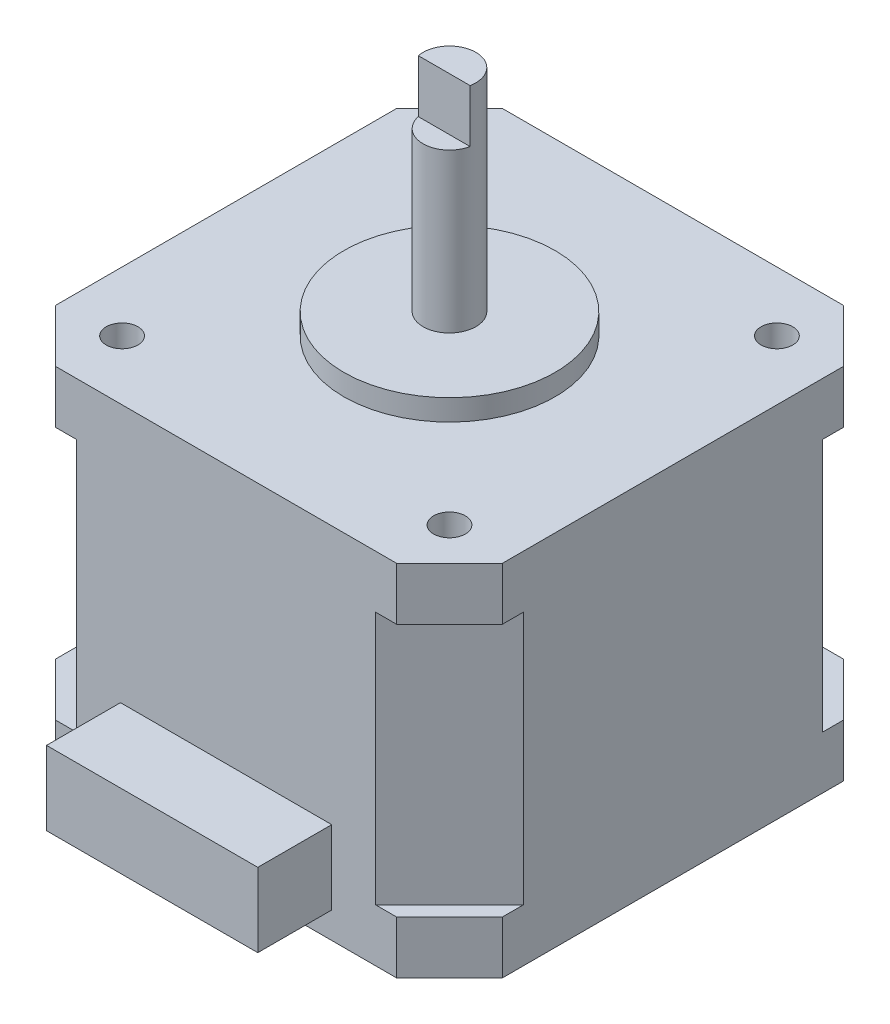
ISO-10303-21;
HEADER;
FILE_DESCRIPTION(('STEP AP214'),'2;1');
FILE_NAME('part.step','',(''),(''),'','','');
FILE_SCHEMA(('AUTOMOTIVE_DESIGN { 1 0 10303 214 1 1 1 1 }'));
ENDSEC;
DATA;
#1=APPLICATION_CONTEXT('core data for automotive mechanical design processes');
#2=APPLICATION_PROTOCOL_DEFINITION('international standard','automotive_design',2000,#1);
#3=PRODUCT_CONTEXT('',#1,'mechanical');
#4=PRODUCT('Part','Part','',(#3));
#5=PRODUCT_RELATED_PRODUCT_CATEGORY('part','',(#4));
#6=PRODUCT_DEFINITION_FORMATION('','',#4);
#7=PRODUCT_DEFINITION_CONTEXT('part definition',#1,'design');
#8=PRODUCT_DEFINITION('design','',#6,#7);
#9=PRODUCT_DEFINITION_SHAPE('','',#8);
#10=(LENGTH_UNIT() NAMED_UNIT(*) SI_UNIT(.MILLI.,.METRE.));
#11=(NAMED_UNIT(*) PLANE_ANGLE_UNIT() SI_UNIT($,.RADIAN.));
#12=(NAMED_UNIT(*) SI_UNIT($,.STERADIAN.) SOLID_ANGLE_UNIT());
#13=UNCERTAINTY_MEASURE_WITH_UNIT(LENGTH_MEASURE(1.E-05),#10,'distance_accuracy_value','');
#14=(GEOMETRIC_REPRESENTATION_CONTEXT(3) GLOBAL_UNCERTAINTY_ASSIGNED_CONTEXT((#13)) GLOBAL_UNIT_ASSIGNED_CONTEXT((#10,
#11,#12)) REPRESENTATION_CONTEXT('',''));
#15=CARTESIAN_POINT('',(0.,0.,0.));
#16=DIRECTION('',(0.,0.,1.));
#17=DIRECTION('',(1.,0.,0.));
#18=AXIS2_PLACEMENT_3D('',#15,#16,#17);
#19=CARTESIAN_POINT('',(-21.15,5.,21.15));
#20=DIRECTION('',(0.,0.,-1.));
#21=DIRECTION('',(-1.,0.,0.));
#22=AXIS2_PLACEMENT_3D('',#19,#20,#21);
#23=PLANE('',#22);
#24=DIRECTION('',(1.,0.,0.));
#25=VECTOR('',#24,1.);
#26=CARTESIAN_POINT('',(-21.15,29.,21.15));
#27=LINE('',#26,#25);
#28=CARTESIAN_POINT('',(14.15,29.,21.15));
#29=VERTEX_POINT('',#28);
#30=CARTESIAN_POINT('',(16.15,29.,21.15));
#31=VERTEX_POINT('',#30);
#32=EDGE_CURVE('E358',#29,#31,#27,.T.);
#33=ORIENTED_EDGE('',*,*,#32,.T.);
#34=DIRECTION('',(0.,1.,0.));
#35=VECTOR('',#34,1.);
#36=CARTESIAN_POINT('',(16.15,5.,21.15));
#37=LINE('',#36,#35);
#38=CARTESIAN_POINT('',(16.15,34.,21.15));
#39=VERTEX_POINT('',#38);
#40=EDGE_CURVE('E548',#31,#39,#37,.T.);
#41=ORIENTED_EDGE('',*,*,#40,.T.);
#42=DIRECTION('',(1.,0.,0.));
#43=VECTOR('',#42,1.);
#44=CARTESIAN_POINT('',(-21.15,34.,21.15));
#45=LINE('',#44,#43);
#46=CARTESIAN_POINT('',(-16.15,34.,21.15));
#47=VERTEX_POINT('',#46);
#48=EDGE_CURVE('E342',#47,#39,#45,.T.);
#49=ORIENTED_EDGE('',*,*,#48,.F.);
#50=DIRECTION('',(0.,-1.,0.));
#51=VECTOR('',#50,1.);
#52=CARTESIAN_POINT('',(-16.15,5.,21.15));
#53=LINE('',#52,#51);
#54=CARTESIAN_POINT('',(-16.15,29.,21.15));
#55=VERTEX_POINT('',#54);
#56=EDGE_CURVE('E544',#47,#55,#53,.T.);
#57=ORIENTED_EDGE('',*,*,#56,.T.);
#58=CARTESIAN_POINT('',(-14.15,29.,21.15));
#59=VERTEX_POINT('',#58);
#60=EDGE_CURVE('E334',#55,#59,#27,.T.);
#61=ORIENTED_EDGE('',*,*,#60,.T.);
#62=DIRECTION('',(0.,-1.,0.));
#63=VECTOR('',#62,1.);
#64=CARTESIAN_POINT('',(-14.15,29.,21.15));
#65=LINE('',#64,#63);
#66=CARTESIAN_POINT('',(-14.15,5.,21.15));
#67=VERTEX_POINT('',#66);
#68=EDGE_CURVE('E408',#59,#67,#65,.T.);
#69=ORIENTED_EDGE('',*,*,#68,.T.);
#70=DIRECTION('',(1.,0.,0.));
#71=VECTOR('',#70,1.);
#72=CARTESIAN_POINT('',(-21.15,5.,21.15));
#73=LINE('',#72,#71);
#74=CARTESIAN_POINT('',(-16.15,5.,21.15));
#75=VERTEX_POINT('',#74);
#76=EDGE_CURVE('E438',#75,#67,#73,.T.);
#77=ORIENTED_EDGE('',*,*,#76,.F.);
#78=DIRECTION('',(0.,-1.,0.));
#79=VECTOR('',#78,1.);
#80=CARTESIAN_POINT('',(-16.15,5.,21.15));
#81=LINE('',#80,#79);
#82=CARTESIAN_POINT('',(-16.15,0.,21.15));
#83=VERTEX_POINT('',#82);
#84=EDGE_CURVE('E508',#75,#83,#81,.T.);
#85=ORIENTED_EDGE('',*,*,#84,.T.);
#86=DIRECTION('',(1.,0.,0.));
#87=VECTOR('',#86,1.);
#88=CARTESIAN_POINT('',(-21.15,0.,21.15));
#89=LINE('',#88,#87);
#90=CARTESIAN_POINT('',(16.15,0.,21.15));
#91=VERTEX_POINT('',#90);
#92=EDGE_CURVE('E453',#83,#91,#89,.T.);
#93=ORIENTED_EDGE('',*,*,#92,.T.);
#94=DIRECTION('',(0.,1.,0.));
#95=VECTOR('',#94,1.);
#96=CARTESIAN_POINT('',(16.15,5.,21.15));
#97=LINE('',#96,#95);
#98=CARTESIAN_POINT('',(16.15,5.,21.15));
#99=VERTEX_POINT('',#98);
#100=EDGE_CURVE('E504',#91,#99,#97,.T.);
#101=ORIENTED_EDGE('',*,*,#100,.T.);
#102=CARTESIAN_POINT('',(14.15,5.,21.15));
#103=VERTEX_POINT('',#102);
#104=EDGE_CURVE('E437',#103,#99,#73,.T.);
#105=ORIENTED_EDGE('',*,*,#104,.F.);
#106=DIRECTION('',(0.,-1.,0.));
#107=VECTOR('',#106,1.);
#108=CARTESIAN_POINT('',(14.15,29.,21.15));
#109=LINE('',#108,#107);
#110=EDGE_CURVE('E404',#29,#103,#109,.T.);
#111=ORIENTED_EDGE('',*,*,#110,.F.);
#112=EDGE_LOOP('',(#33,#41,#49,#57,#61,#69,#77,#85,#93,#101,#105,#111));
#113=FACE_BOUND('',#112,.T.);
#114=DIRECTION('',(0.,1.,0.));
#115=VECTOR('',#114,1.);
#116=CARTESIAN_POINT('',(10.,2.5,21.15));
#117=LINE('',#116,#115);
#118=CARTESIAN_POINT('',(10.,2.5,21.15));
#119=VERTEX_POINT('',#118);
#120=CARTESIAN_POINT('',(10.,9.5,21.15));
#121=VERTEX_POINT('',#120);
#122=EDGE_CURVE('E278',#119,#121,#117,.T.);
#123=ORIENTED_EDGE('',*,*,#122,.F.);
#124=DIRECTION('',(1.,0.,0.));
#125=VECTOR('',#124,1.);
#126=CARTESIAN_POINT('',(-10.,2.5,21.15));
#127=LINE('',#126,#125);
#128=CARTESIAN_POINT('',(-10.,2.5,21.15));
#129=VERTEX_POINT('',#128);
#130=EDGE_CURVE('E285',#129,#119,#127,.T.);
#131=ORIENTED_EDGE('',*,*,#130,.F.);
#132=DIRECTION('',(0.,-1.,0.));
#133=VECTOR('',#132,1.);
#134=CARTESIAN_POINT('',(-10.,2.5,21.15));
#135=LINE('',#134,#133);
#136=CARTESIAN_POINT('',(-10.,9.5,21.15));
#137=VERTEX_POINT('',#136);
#138=EDGE_CURVE('E300',#137,#129,#135,.T.);
#139=ORIENTED_EDGE('',*,*,#138,.F.);
#140=DIRECTION('',(-1.,0.,0.));
#141=VECTOR('',#140,1.);
#142=CARTESIAN_POINT('',(-10.,9.5,21.15));
#143=LINE('',#142,#141);
#144=EDGE_CURVE('E79',#121,#137,#143,.T.);
#145=ORIENTED_EDGE('',*,*,#144,.F.);
#146=EDGE_LOOP('',(#123,#131,#139,#145));
#147=FACE_BOUND('',#146,.T.);
#148=ADVANCED_FACE('F52',(#113,#147),#23,.F.);
#149=CARTESIAN_POINT('',(0.,5.,0.));
#150=DIRECTION('',(0.,-1.,0.));
#151=DIRECTION('',(0.,0.,-1.));
#152=AXIS2_PLACEMENT_3D('',#149,#150,#151);
#153=PLANE('',#152);
#154=DIRECTION('',(-0.707106781186548,0.,-0.707106781186547));
#155=VECTOR('',#154,1.);
#156=CARTESIAN_POINT('',(14.15,5.,-21.15));
#157=LINE('',#156,#155);
#158=CARTESIAN_POINT('',(21.15,5.,-14.15));
#159=VERTEX_POINT('',#158);
#160=CARTESIAN_POINT('',(14.15,5.,-21.15));
#161=VERTEX_POINT('',#160);
#162=EDGE_CURVE('E366',#159,#161,#157,.T.);
#163=ORIENTED_EDGE('',*,*,#162,.F.);
#164=DIRECTION('',(0.,0.,-1.));
#165=VECTOR('',#164,1.);
#166=CARTESIAN_POINT('',(21.15,5.,21.15));
#167=LINE('',#166,#165);
#168=CARTESIAN_POINT('',(21.15,5.,-16.15));
#169=VERTEX_POINT('',#168);
#170=EDGE_CURVE('E429',#159,#169,#167,.T.);
#171=ORIENTED_EDGE('',*,*,#170,.T.);
#172=DIRECTION('',(0.707106781186546,0.,0.707106781186549));
#173=VECTOR('',#172,1.);
#174=CARTESIAN_POINT('',(16.15,5.,-21.15));
#175=LINE('',#174,#173);
#176=CARTESIAN_POINT('',(16.15,5.,-21.15));
#177=VERTEX_POINT('',#176);
#178=EDGE_CURVE('E493',#169,#177,#175,.F.);
#179=ORIENTED_EDGE('',*,*,#178,.T.);
#180=DIRECTION('',(-1.,0.,0.));
#181=VECTOR('',#180,1.);
#182=CARTESIAN_POINT('',(-21.15,5.,-21.15));
#183=LINE('',#182,#181);
#184=EDGE_CURVE('E430',#177,#161,#183,.T.);
#185=ORIENTED_EDGE('',*,*,#184,.T.);
#186=EDGE_LOOP('',(#163,#171,#179,#185));
#187=FACE_BOUND('',#186,.T.);
#188=ADVANCED_FACE('F657',(#187),#153,.F.);
#189=DIRECTION('',(0.707106781186547,0.,-0.707106781186548));
#190=VECTOR('',#189,1.);
#191=CARTESIAN_POINT('',(14.15,5.,21.15));
#192=LINE('',#191,#190);
#193=CARTESIAN_POINT('',(21.15,5.,14.15));
#194=VERTEX_POINT('',#193);
#195=EDGE_CURVE('E386',#103,#194,#192,.T.);
#196=ORIENTED_EDGE('',*,*,#195,.F.);
#197=ORIENTED_EDGE('',*,*,#104,.T.);
#198=DIRECTION('',(-0.707106781186549,0.,0.707106781186546));
#199=VECTOR('',#198,1.);
#200=CARTESIAN_POINT('',(21.15,5.,16.15));
#201=LINE('',#200,#199);
#202=CARTESIAN_POINT('',(21.15,5.,16.15));
#203=VERTEX_POINT('',#202);
#204=EDGE_CURVE('E484',#99,#203,#201,.F.);
#205=ORIENTED_EDGE('',*,*,#204,.T.);
#206=EDGE_CURVE('E425',#203,#194,#167,.T.);
#207=ORIENTED_EDGE('',*,*,#206,.T.);
#208=EDGE_LOOP('',(#196,#197,#205,#207));
#209=FACE_BOUND('',#208,.T.);
#210=ADVANCED_FACE('F664',(#209),#153,.F.);
#211=DIRECTION('',(0.707106781186547,0.,0.707106781186548));
#212=VECTOR('',#211,1.);
#213=CARTESIAN_POINT('',(-21.15,5.,14.15));
#214=LINE('',#213,#212);
#215=CARTESIAN_POINT('',(-21.15,5.,14.15));
#216=VERTEX_POINT('',#215);
#217=EDGE_CURVE('E382',#216,#67,#214,.T.);
#218=ORIENTED_EDGE('',*,*,#217,.F.);
#219=DIRECTION('',(0.,0.,1.));
#220=VECTOR('',#219,1.);
#221=CARTESIAN_POINT('',(-21.15,5.,21.15));
#222=LINE('',#221,#220);
#223=CARTESIAN_POINT('',(-21.15,5.,16.15));
#224=VERTEX_POINT('',#223);
#225=EDGE_CURVE('E433',#216,#224,#222,.T.);
#226=ORIENTED_EDGE('',*,*,#225,.T.);
#227=DIRECTION('',(-0.707106781186546,0.,-0.707106781186549));
#228=VECTOR('',#227,1.);
#229=CARTESIAN_POINT('',(-16.15,5.,21.15));
#230=LINE('',#229,#228);
#231=EDGE_CURVE('E487',#224,#75,#230,.F.);
#232=ORIENTED_EDGE('',*,*,#231,.T.);
#233=ORIENTED_EDGE('',*,*,#76,.T.);
#234=EDGE_LOOP('',(#218,#226,#232,#233));
#235=FACE_BOUND('',#234,.T.);
#236=ADVANCED_FACE('F725',(#235),#153,.F.);
#237=DIRECTION('',(-0.707106781186547,0.,0.707106781186548));
#238=VECTOR('',#237,1.);
#239=CARTESIAN_POINT('',(-21.15,5.,-14.15));
#240=LINE('',#239,#238);
#241=CARTESIAN_POINT('',(-14.15,5.,-21.15));
#242=VERTEX_POINT('',#241);
#243=CARTESIAN_POINT('',(-21.15,5.,-14.15));
#244=VERTEX_POINT('',#243);
#245=EDGE_CURVE('E346',#242,#244,#240,.T.);
#246=ORIENTED_EDGE('',*,*,#245,.F.);
#247=CARTESIAN_POINT('',(-16.15,5.,-21.15));
#248=VERTEX_POINT('',#247);
#249=EDGE_CURVE('E428',#242,#248,#183,.T.);
#250=ORIENTED_EDGE('',*,*,#249,.T.);
#251=DIRECTION('',(0.707106781186549,0.,-0.707106781186546));
#252=VECTOR('',#251,1.);
#253=CARTESIAN_POINT('',(-21.15,5.,-16.15));
#254=LINE('',#253,#252);
#255=CARTESIAN_POINT('',(-21.15,5.,-16.15));
#256=VERTEX_POINT('',#255);
#257=EDGE_CURVE('E490',#248,#256,#254,.F.);
#258=ORIENTED_EDGE('',*,*,#257,.T.);
#259=EDGE_CURVE('E434',#256,#244,#222,.T.);
#260=ORIENTED_EDGE('',*,*,#259,.T.);
#261=EDGE_LOOP('',(#246,#250,#258,#260));
#262=FACE_BOUND('',#261,.T.);
#263=ADVANCED_FACE('F588',(#262),#153,.F.);
#264=CARTESIAN_POINT('',(21.15,5.,21.15));
#265=DIRECTION('',(-1.,0.,0.));
#266=DIRECTION('',(0.,0.,1.));
#267=AXIS2_PLACEMENT_3D('',#264,#265,#266);
#268=PLANE('',#267);
#269=DIRECTION('',(0.,0.,-1.));
#270=VECTOR('',#269,1.);
#271=CARTESIAN_POINT('',(21.15,29.,-21.15));
#272=LINE('',#271,#270);
#273=CARTESIAN_POINT('',(21.15,29.,-14.15));
#274=VERTEX_POINT('',#273);
#275=CARTESIAN_POINT('',(21.15,29.,-16.15));
#276=VERTEX_POINT('',#275);
#277=EDGE_CURVE('E325',#274,#276,#272,.T.);
#278=ORIENTED_EDGE('',*,*,#277,.T.);
#279=DIRECTION('',(0.,1.,0.));
#280=VECTOR('',#279,1.);
#281=CARTESIAN_POINT('',(21.15,5.,-16.15));
#282=LINE('',#281,#280);
#283=CARTESIAN_POINT('',(21.15,34.,-16.15));
#284=VERTEX_POINT('',#283);
#285=EDGE_CURVE('E526',#276,#284,#282,.T.);
#286=ORIENTED_EDGE('',*,*,#285,.T.);
#287=DIRECTION('',(0.,0.,-1.));
#288=VECTOR('',#287,1.);
#289=CARTESIAN_POINT('',(21.15,34.,-21.15));
#290=LINE('',#289,#288);
#291=CARTESIAN_POINT('',(21.15,34.,16.15));
#292=VERTEX_POINT('',#291);
#293=EDGE_CURVE('E329',#292,#284,#290,.T.);
#294=ORIENTED_EDGE('',*,*,#293,.F.);
#295=DIRECTION('',(0.,-1.,0.));
#296=VECTOR('',#295,1.);
#297=CARTESIAN_POINT('',(21.15,5.,16.15));
#298=LINE('',#297,#296);
#299=CARTESIAN_POINT('',(21.15,29.,16.15));
#300=VERTEX_POINT('',#299);
#301=EDGE_CURVE('E522',#292,#300,#298,.T.);
#302=ORIENTED_EDGE('',*,*,#301,.T.);
#303=CARTESIAN_POINT('',(21.15,29.,14.15));
#304=VERTEX_POINT('',#303);
#305=EDGE_CURVE('E347',#300,#304,#272,.T.);
#306=ORIENTED_EDGE('',*,*,#305,.T.);
#307=DIRECTION('',(0.,-1.,0.));
#308=VECTOR('',#307,1.);
#309=CARTESIAN_POINT('',(21.15,29.,14.15));
#310=LINE('',#309,#308);
#311=EDGE_CURVE('E400',#304,#194,#310,.T.);
#312=ORIENTED_EDGE('',*,*,#311,.T.);
#313=ORIENTED_EDGE('',*,*,#206,.F.);
#314=DIRECTION('',(0.,-1.,0.));
#315=VECTOR('',#314,1.);
#316=CARTESIAN_POINT('',(21.15,5.,16.15));
#317=LINE('',#316,#315);
#318=CARTESIAN_POINT('',(21.15,0.,16.15));
#319=VERTEX_POINT('',#318);
#320=EDGE_CURVE('E476',#203,#319,#317,.T.);
#321=ORIENTED_EDGE('',*,*,#320,.T.);
#322=DIRECTION('',(0.,0.,-1.));
#323=VECTOR('',#322,1.);
#324=CARTESIAN_POINT('',(21.15,0.,21.15));
#325=LINE('',#324,#323);
#326=CARTESIAN_POINT('',(21.15,0.,-16.15));
#327=VERTEX_POINT('',#326);
#328=EDGE_CURVE('E424',#319,#327,#325,.T.);
#329=ORIENTED_EDGE('',*,*,#328,.T.);
#330=DIRECTION('',(0.,1.,0.));
#331=VECTOR('',#330,1.);
#332=CARTESIAN_POINT('',(21.15,5.,-16.15));
#333=LINE('',#332,#331);
#334=EDGE_CURVE('E480',#327,#169,#333,.T.);
#335=ORIENTED_EDGE('',*,*,#334,.T.);
#336=ORIENTED_EDGE('',*,*,#170,.F.);
#337=DIRECTION('',(0.,-1.,0.));
#338=VECTOR('',#337,1.);
#339=CARTESIAN_POINT('',(21.15,29.,-14.15));
#340=LINE('',#339,#338);
#341=EDGE_CURVE('E396',#274,#159,#340,.T.);
#342=ORIENTED_EDGE('',*,*,#341,.F.);
#343=EDGE_LOOP('',(#278,#286,#294,#302,#306,#312,#313,#321,#329,#335,#336,#342));
#344=FACE_BOUND('',#343,.T.);
#345=ADVANCED_FACE('F602',(#344),#268,.F.);
#346=CARTESIAN_POINT('',(-21.15,5.,-21.15));
#347=DIRECTION('',(0.,0.,1.));
#348=DIRECTION('',(1.,0.,0.));
#349=AXIS2_PLACEMENT_3D('',#346,#347,#348);
#350=PLANE('',#349);
#351=DIRECTION('',(-1.,0.,0.));
#352=VECTOR('',#351,1.);
#353=CARTESIAN_POINT('',(-21.15,34.,-21.15));
#354=LINE('',#353,#352);
#355=CARTESIAN_POINT('',(16.15,34.,-21.15));
#356=VERTEX_POINT('',#355);
#357=CARTESIAN_POINT('',(-16.15,34.,-21.15));
#358=VERTEX_POINT('',#357);
#359=EDGE_CURVE('E333',#356,#358,#354,.T.);
#360=ORIENTED_EDGE('',*,*,#359,.F.);
#361=DIRECTION('',(0.,-1.,0.));
#362=VECTOR('',#361,1.);
#363=CARTESIAN_POINT('',(16.15,5.,-21.15));
#364=LINE('',#363,#362);
#365=CARTESIAN_POINT('',(16.15,29.,-21.15));
#366=VERTEX_POINT('',#365);
#367=EDGE_CURVE('E515',#356,#366,#364,.T.);
#368=ORIENTED_EDGE('',*,*,#367,.T.);
#369=DIRECTION('',(-1.,0.,0.));
#370=VECTOR('',#369,1.);
#371=CARTESIAN_POINT('',(-21.15,29.,-21.15));
#372=LINE('',#371,#370);
#373=CARTESIAN_POINT('',(14.15,29.,-21.15));
#374=VERTEX_POINT('',#373);
#375=EDGE_CURVE('E351',#366,#374,#372,.T.);
#376=ORIENTED_EDGE('',*,*,#375,.T.);
#377=DIRECTION('',(0.,-1.,0.));
#378=VECTOR('',#377,1.);
#379=CARTESIAN_POINT('',(14.15,29.,-21.15));
#380=LINE('',#379,#378);
#381=EDGE_CURVE('E378',#374,#161,#380,.T.);
#382=ORIENTED_EDGE('',*,*,#381,.T.);
#383=ORIENTED_EDGE('',*,*,#184,.F.);
#384=DIRECTION('',(0.,-1.,0.));
#385=VECTOR('',#384,1.);
#386=CARTESIAN_POINT('',(16.15,5.,-21.15));
#387=LINE('',#386,#385);
#388=CARTESIAN_POINT('',(16.15,0.,-21.15));
#389=VERTEX_POINT('',#388);
#390=EDGE_CURVE('E460',#177,#389,#387,.T.);
#391=ORIENTED_EDGE('',*,*,#390,.T.);
#392=DIRECTION('',(-1.,0.,0.));
#393=VECTOR('',#392,1.);
#394=CARTESIAN_POINT('',(-21.15,0.,-21.15));
#395=LINE('',#394,#393);
#396=CARTESIAN_POINT('',(-16.15,0.,-21.15));
#397=VERTEX_POINT('',#396);
#398=EDGE_CURVE('E445',#389,#397,#395,.T.);
#399=ORIENTED_EDGE('',*,*,#398,.T.);
#400=DIRECTION('',(0.,1.,0.));
#401=VECTOR('',#400,1.);
#402=CARTESIAN_POINT('',(-16.15,5.,-21.15));
#403=LINE('',#402,#401);
#404=EDGE_CURVE('E441',#397,#248,#403,.T.);
#405=ORIENTED_EDGE('',*,*,#404,.T.);
#406=ORIENTED_EDGE('',*,*,#249,.F.);
#407=DIRECTION('',(0.,-1.,0.));
#408=VECTOR('',#407,1.);
#409=CARTESIAN_POINT('',(-14.15,29.,-21.15));
#410=LINE('',#409,#408);
#411=CARTESIAN_POINT('',(-14.15,29.,-21.15));
#412=VERTEX_POINT('',#411);
#413=EDGE_CURVE('E420',#412,#242,#410,.T.);
#414=ORIENTED_EDGE('',*,*,#413,.F.);
#415=CARTESIAN_POINT('',(-16.15,29.,-21.15));
#416=VERTEX_POINT('',#415);
#417=EDGE_CURVE('E350',#412,#416,#372,.T.);
#418=ORIENTED_EDGE('',*,*,#417,.T.);
#419=DIRECTION('',(0.,1.,0.));
#420=VECTOR('',#419,1.);
#421=CARTESIAN_POINT('',(-16.15,5.,-21.15));
#422=LINE('',#421,#420);
#423=EDGE_CURVE('E512',#416,#358,#422,.T.);
#424=ORIENTED_EDGE('',*,*,#423,.T.);
#425=EDGE_LOOP('',(#360,#368,#376,#382,#383,#391,#399,#405,#406,#414,#418,#424));
#426=FACE_BOUND('',#425,.T.);
#427=ADVANCED_FACE('F575',(#426),#350,.F.);
#428=CARTESIAN_POINT('',(-21.15,5.,21.15));
#429=DIRECTION('',(1.,0.,0.));
#430=DIRECTION('',(0.,0.,-1.));
#431=AXIS2_PLACEMENT_3D('',#428,#429,#430);
#432=PLANE('',#431);
#433=DIRECTION('',(0.,0.,1.));
#434=VECTOR('',#433,1.);
#435=CARTESIAN_POINT('',(-21.15,29.,-21.15));
#436=LINE('',#435,#434);
#437=CARTESIAN_POINT('',(-21.15,29.,14.15));
#438=VERTEX_POINT('',#437);
#439=CARTESIAN_POINT('',(-21.15,29.,16.15));
#440=VERTEX_POINT('',#439);
#441=EDGE_CURVE('E354',#438,#440,#436,.T.);
#442=ORIENTED_EDGE('',*,*,#441,.T.);
#443=DIRECTION('',(0.,1.,0.));
#444=VECTOR('',#443,1.);
#445=CARTESIAN_POINT('',(-21.15,5.,16.15));
#446=LINE('',#445,#444);
#447=CARTESIAN_POINT('',(-21.15,34.,16.15));
#448=VERTEX_POINT('',#447);
#449=EDGE_CURVE('E557',#440,#448,#446,.T.);
#450=ORIENTED_EDGE('',*,*,#449,.T.);
#451=DIRECTION('',(0.,0.,1.));
#452=VECTOR('',#451,1.);
#453=CARTESIAN_POINT('',(-21.15,34.,-21.15));
#454=LINE('',#453,#452);
#455=CARTESIAN_POINT('',(-21.15,34.,-16.15));
#456=VERTEX_POINT('',#455);
#457=EDGE_CURVE('E338',#456,#448,#454,.T.);
#458=ORIENTED_EDGE('',*,*,#457,.F.);
#459=DIRECTION('',(0.,-1.,0.));
#460=VECTOR('',#459,1.);
#461=CARTESIAN_POINT('',(-21.15,5.,-16.15));
#462=LINE('',#461,#460);
#463=CARTESIAN_POINT('',(-21.15,29.,-16.15));
#464=VERTEX_POINT('',#463);
#465=EDGE_CURVE('E554',#456,#464,#462,.T.);
#466=ORIENTED_EDGE('',*,*,#465,.T.);
#467=CARTESIAN_POINT('',(-21.15,29.,-14.15));
#468=VERTEX_POINT('',#467);
#469=EDGE_CURVE('E355',#464,#468,#436,.T.);
#470=ORIENTED_EDGE('',*,*,#469,.T.);
#471=DIRECTION('',(0.,-1.,0.));
#472=VECTOR('',#471,1.);
#473=CARTESIAN_POINT('',(-21.15,29.,-14.15));
#474=LINE('',#473,#472);
#475=EDGE_CURVE('E416',#468,#244,#474,.T.);
#476=ORIENTED_EDGE('',*,*,#475,.T.);
#477=ORIENTED_EDGE('',*,*,#259,.F.);
#478=DIRECTION('',(0.,-1.,0.));
#479=VECTOR('',#478,1.);
#480=CARTESIAN_POINT('',(-21.15,5.,-16.15));
#481=LINE('',#480,#479);
#482=CARTESIAN_POINT('',(-21.15,0.,-16.15));
#483=VERTEX_POINT('',#482);
#484=EDGE_CURVE('E500',#256,#483,#481,.T.);
#485=ORIENTED_EDGE('',*,*,#484,.T.);
#486=DIRECTION('',(0.,0.,1.));
#487=VECTOR('',#486,1.);
#488=CARTESIAN_POINT('',(-21.15,0.,21.15));
#489=LINE('',#488,#487);
#490=CARTESIAN_POINT('',(-21.15,0.,16.15));
#491=VERTEX_POINT('',#490);
#492=EDGE_CURVE('E449',#483,#491,#489,.T.);
#493=ORIENTED_EDGE('',*,*,#492,.T.);
#494=DIRECTION('',(0.,1.,0.));
#495=VECTOR('',#494,1.);
#496=CARTESIAN_POINT('',(-21.15,5.,16.15));
#497=LINE('',#496,#495);
#498=EDGE_CURVE('E496',#491,#224,#497,.T.);
#499=ORIENTED_EDGE('',*,*,#498,.T.);
#500=ORIENTED_EDGE('',*,*,#225,.F.);
#501=DIRECTION('',(0.,-1.,0.));
#502=VECTOR('',#501,1.);
#503=CARTESIAN_POINT('',(-21.15,29.,14.15));
#504=LINE('',#503,#502);
#505=EDGE_CURVE('E412',#438,#216,#504,.T.);
#506=ORIENTED_EDGE('',*,*,#505,.F.);
#507=EDGE_LOOP('',(#442,#450,#458,#466,#470,#476,#477,#485,#493,#499,#500,#506));
#508=FACE_BOUND('',#507,.T.);
#509=ADVANCED_FACE('F582',(#508),#432,.F.);
#510=CARTESIAN_POINT('',(0.,0.,0.));
#511=DIRECTION('',(0.,-1.,0.));
#512=DIRECTION('',(0.,0.,-1.));
#513=AXIS2_PLACEMENT_3D('',#510,#511,#512);
#514=PLANE('',#513);
#515=ORIENTED_EDGE('',*,*,#398,.F.);
#516=DIRECTION('',(-0.707106781186546,0.,-0.707106781186549));
#517=VECTOR('',#516,1.);
#518=CARTESIAN_POINT('',(18.65,0.,-18.65));
#519=LINE('',#518,#517);
#520=EDGE_CURVE('E473',#389,#327,#519,.F.);
#521=ORIENTED_EDGE('',*,*,#520,.T.);
#522=ORIENTED_EDGE('',*,*,#328,.F.);
#523=DIRECTION('',(0.707106781186549,0.,-0.707106781186546));
#524=VECTOR('',#523,1.);
#525=CARTESIAN_POINT('',(18.65,0.,18.65));
#526=LINE('',#525,#524);
#527=EDGE_CURVE('E464',#319,#91,#526,.F.);
#528=ORIENTED_EDGE('',*,*,#527,.T.);
#529=ORIENTED_EDGE('',*,*,#92,.F.);
#530=DIRECTION('',(0.707106781186546,0.,0.707106781186549));
#531=VECTOR('',#530,1.);
#532=CARTESIAN_POINT('',(-18.65,0.,18.65));
#533=LINE('',#532,#531);
#534=EDGE_CURVE('E467',#83,#491,#533,.F.);
#535=ORIENTED_EDGE('',*,*,#534,.T.);
#536=ORIENTED_EDGE('',*,*,#492,.F.);
#537=DIRECTION('',(-0.707106781186549,0.,0.707106781186546));
#538=VECTOR('',#537,1.);
#539=CARTESIAN_POINT('',(-18.65,0.,-18.65));
#540=LINE('',#539,#538);
#541=EDGE_CURVE('E470',#483,#397,#540,.F.);
#542=ORIENTED_EDGE('',*,*,#541,.T.);
#543=EDGE_LOOP('',(#515,#521,#522,#528,#529,#535,#536,#542));
#544=FACE_BOUND('',#543,.T.);
#545=ADVANCED_FACE('F626',(#544),#514,.T.);
#546=CARTESIAN_POINT('',(16.15,5.,-21.15));
#547=DIRECTION('',(-0.707106781186549,0.,0.707106781186546));
#548=DIRECTION('',(0.,-1.,0.));
#549=AXIS2_PLACEMENT_3D('',#546,#547,#548);
#550=PLANE('',#549);
#551=ORIENTED_EDGE('',*,*,#178,.F.);
#552=ORIENTED_EDGE('',*,*,#334,.F.);
#553=ORIENTED_EDGE('',*,*,#520,.F.);
#554=ORIENTED_EDGE('',*,*,#390,.F.);
#555=EDGE_LOOP('',(#551,#552,#553,#554));
#556=FACE_BOUND('',#555,.T.);
#557=ADVANCED_FACE('F622',(#556),#550,.F.);
#558=CARTESIAN_POINT('',(-21.15,5.,-16.15));
#559=DIRECTION('',(0.707106781186546,0.,0.707106781186549));
#560=DIRECTION('',(0.,-1.,0.));
#561=AXIS2_PLACEMENT_3D('',#558,#559,#560);
#562=PLANE('',#561);
#563=ORIENTED_EDGE('',*,*,#257,.F.);
#564=ORIENTED_EDGE('',*,*,#404,.F.);
#565=ORIENTED_EDGE('',*,*,#541,.F.);
#566=ORIENTED_EDGE('',*,*,#484,.F.);
#567=EDGE_LOOP('',(#563,#564,#565,#566));
#568=FACE_BOUND('',#567,.T.);
#569=ADVANCED_FACE('F646',(#568),#562,.F.);
#570=CARTESIAN_POINT('',(-16.15,5.,21.15));
#571=DIRECTION('',(0.707106781186549,0.,-0.707106781186546));
#572=DIRECTION('',(0.,-1.,0.));
#573=AXIS2_PLACEMENT_3D('',#570,#571,#572);
#574=PLANE('',#573);
#575=ORIENTED_EDGE('',*,*,#231,.F.);
#576=ORIENTED_EDGE('',*,*,#498,.F.);
#577=ORIENTED_EDGE('',*,*,#534,.F.);
#578=ORIENTED_EDGE('',*,*,#84,.F.);
#579=EDGE_LOOP('',(#575,#576,#577,#578));
#580=FACE_BOUND('',#579,.T.);
#581=ADVANCED_FACE('F640',(#580),#574,.F.);
#582=CARTESIAN_POINT('',(21.15,5.,16.15));
#583=DIRECTION('',(-0.707106781186546,0.,-0.707106781186549));
#584=DIRECTION('',(0.,-1.,0.));
#585=AXIS2_PLACEMENT_3D('',#582,#583,#584);
#586=PLANE('',#585);
#587=ORIENTED_EDGE('',*,*,#204,.F.);
#588=ORIENTED_EDGE('',*,*,#100,.F.);
#589=ORIENTED_EDGE('',*,*,#527,.F.);
#590=ORIENTED_EDGE('',*,*,#320,.F.);
#591=EDGE_LOOP('',(#587,#588,#589,#590));
#592=FACE_BOUND('',#591,.T.);
#593=ADVANCED_FACE('F631',(#592),#586,.F.);
#594=CARTESIAN_POINT('',(-21.15,29.,-14.15));
#595=DIRECTION('',(0.707106781186548,0.,0.707106781186547));
#596=DIRECTION('',(0.707106781186547,0.,-0.707106781186548));
#597=AXIS2_PLACEMENT_3D('',#594,#595,#596);
#598=PLANE('',#597);
#599=ORIENTED_EDGE('',*,*,#245,.T.);
#600=ORIENTED_EDGE('',*,*,#475,.F.);
#601=DIRECTION('',(-0.707106781186547,0.,0.707106781186548));
#602=VECTOR('',#601,1.);
#603=CARTESIAN_POINT('',(-21.15,29.,-14.15));
#604=LINE('',#603,#602);
#605=EDGE_CURVE('E361',#412,#468,#604,.T.);
#606=ORIENTED_EDGE('',*,*,#605,.F.);
#607=ORIENTED_EDGE('',*,*,#413,.T.);
#608=EDGE_LOOP('',(#599,#600,#606,#607));
#609=FACE_BOUND('',#608,.T.);
#610=ADVANCED_FACE('F586',(#609),#598,.F.);
#611=CARTESIAN_POINT('',(-21.15,29.,14.15));
#612=DIRECTION('',(0.707106781186548,0.,-0.707106781186547));
#613=DIRECTION('',(-0.707106781186547,0.,-0.707106781186548));
#614=AXIS2_PLACEMENT_3D('',#611,#612,#613);
#615=PLANE('',#614);
#616=ORIENTED_EDGE('',*,*,#217,.T.);
#617=ORIENTED_EDGE('',*,*,#68,.F.);
#618=DIRECTION('',(0.707106781186547,0.,0.707106781186548));
#619=VECTOR('',#618,1.);
#620=CARTESIAN_POINT('',(-21.15,29.,14.15));
#621=LINE('',#620,#619);
#622=EDGE_CURVE('E365',#438,#59,#621,.T.);
#623=ORIENTED_EDGE('',*,*,#622,.F.);
#624=ORIENTED_EDGE('',*,*,#505,.T.);
#625=EDGE_LOOP('',(#616,#617,#623,#624));
#626=FACE_BOUND('',#625,.T.);
#627=ADVANCED_FACE('F728',(#626),#615,.F.);
#628=CARTESIAN_POINT('',(14.15,29.,21.15));
#629=DIRECTION('',(-0.707106781186548,0.,-0.707106781186547));
#630=DIRECTION('',(-0.707106781186547,0.,0.707106781186548));
#631=AXIS2_PLACEMENT_3D('',#628,#629,#630);
#632=PLANE('',#631);
#633=ORIENTED_EDGE('',*,*,#195,.T.);
#634=ORIENTED_EDGE('',*,*,#311,.F.);
#635=DIRECTION('',(0.707106781186547,0.,-0.707106781186548));
#636=VECTOR('',#635,1.);
#637=CARTESIAN_POINT('',(14.15,29.,21.15));
#638=LINE('',#637,#636);
#639=EDGE_CURVE('E370',#29,#304,#638,.T.);
#640=ORIENTED_EDGE('',*,*,#639,.F.);
#641=ORIENTED_EDGE('',*,*,#110,.T.);
#642=EDGE_LOOP('',(#633,#634,#640,#641));
#643=FACE_BOUND('',#642,.T.);
#644=ADVANCED_FACE('F721',(#643),#632,.F.);
#645=CARTESIAN_POINT('',(14.15,29.,-21.15));
#646=DIRECTION('',(-0.707106781186547,0.,0.707106781186548));
#647=DIRECTION('',(0.707106781186548,0.,0.707106781186547));
#648=AXIS2_PLACEMENT_3D('',#645,#646,#647);
#649=PLANE('',#648);
#650=ORIENTED_EDGE('',*,*,#162,.T.);
#651=ORIENTED_EDGE('',*,*,#381,.F.);
#652=DIRECTION('',(-0.707106781186548,0.,-0.707106781186547));
#653=VECTOR('',#652,1.);
#654=CARTESIAN_POINT('',(14.15,29.,-21.15));
#655=LINE('',#654,#653);
#656=EDGE_CURVE('E374',#274,#374,#655,.T.);
#657=ORIENTED_EDGE('',*,*,#656,.F.);
#658=ORIENTED_EDGE('',*,*,#341,.T.);
#659=EDGE_LOOP('',(#650,#651,#657,#658));
#660=FACE_BOUND('',#659,.T.);
#661=ADVANCED_FACE('F615',(#660),#649,.F.);
#662=CARTESIAN_POINT('',(0.,29.,0.));
#663=DIRECTION('',(0.,1.,0.));
#664=DIRECTION('',(0.,0.,1.));
#665=AXIS2_PLACEMENT_3D('',#662,#663,#664);
#666=PLANE('',#665);
#667=ORIENTED_EDGE('',*,*,#469,.F.);
#668=DIRECTION('',(-0.707106781186549,0.,0.707106781186547));
#669=VECTOR('',#668,1.);
#670=CARTESIAN_POINT('',(-21.15,29.,-16.15));
#671=LINE('',#670,#669);
#672=EDGE_CURVE('E57',#464,#416,#671,.F.);
#673=ORIENTED_EDGE('',*,*,#672,.T.);
#674=ORIENTED_EDGE('',*,*,#417,.F.);
#675=ORIENTED_EDGE('',*,*,#605,.T.);
#676=EDGE_LOOP('',(#667,#673,#674,#675));
#677=FACE_BOUND('',#676,.T.);
#678=ADVANCED_FACE('F568',(#677),#666,.F.);
#679=ORIENTED_EDGE('',*,*,#60,.F.);
#680=DIRECTION('',(0.707106781186546,0.,0.707106781186549));
#681=VECTOR('',#680,1.);
#682=CARTESIAN_POINT('',(-16.15,29.,21.15));
#683=LINE('',#682,#681);
#684=EDGE_CURVE('E551',#55,#440,#683,.F.);
#685=ORIENTED_EDGE('',*,*,#684,.T.);
#686=ORIENTED_EDGE('',*,*,#441,.F.);
#687=ORIENTED_EDGE('',*,*,#622,.T.);
#688=EDGE_LOOP('',(#679,#685,#686,#687));
#689=FACE_BOUND('',#688,.T.);
#690=ADVANCED_FACE('F732',(#689),#666,.F.);
#691=ORIENTED_EDGE('',*,*,#305,.F.);
#692=DIRECTION('',(0.707106781186549,0.,-0.707106781186546));
#693=VECTOR('',#692,1.);
#694=CARTESIAN_POINT('',(21.15,29.,16.15));
#695=LINE('',#694,#693);
#696=EDGE_CURVE('E541',#300,#31,#695,.F.);
#697=ORIENTED_EDGE('',*,*,#696,.T.);
#698=ORIENTED_EDGE('',*,*,#32,.F.);
#699=ORIENTED_EDGE('',*,*,#639,.T.);
#700=EDGE_LOOP('',(#691,#697,#698,#699));
#701=FACE_BOUND('',#700,.T.);
#702=ADVANCED_FACE('F718',(#701),#666,.F.);
#703=ORIENTED_EDGE('',*,*,#375,.F.);
#704=DIRECTION('',(-0.707106781186546,0.,-0.707106781186549));
#705=VECTOR('',#704,1.);
#706=CARTESIAN_POINT('',(16.15,29.,-21.15));
#707=LINE('',#706,#705);
#708=EDGE_CURVE('E519',#366,#276,#707,.F.);
#709=ORIENTED_EDGE('',*,*,#708,.T.);
#710=ORIENTED_EDGE('',*,*,#277,.F.);
#711=ORIENTED_EDGE('',*,*,#656,.T.);
#712=EDGE_LOOP('',(#703,#709,#710,#711));
#713=FACE_BOUND('',#712,.T.);
#714=ADVANCED_FACE('F613',(#713),#666,.F.);
#715=CARTESIAN_POINT('',(0.,34.,0.));
#716=DIRECTION('',(0.,1.,0.));
#717=DIRECTION('',(0.,0.,1.));
#718=AXIS2_PLACEMENT_3D('',#715,#716,#717);
#719=PLANE('',#718);
#720=CARTESIAN_POINT('',(-15.5,34.,15.5));
#721=DIRECTION('',(0.,1.,0.));
#722=DIRECTION('',(0.,0.,1.));
#723=AXIS2_PLACEMENT_3D('',#720,#721,#722);
#724=CIRCLE('',#723,1.5);
#725=CARTESIAN_POINT('',(-15.5,34.,17.));
#726=VERTEX_POINT('',#725);
#727=EDGE_CURVE('E1142',#726,#726,#724,.T.);
#728=ORIENTED_EDGE('',*,*,#727,.F.);
#729=EDGE_LOOP('',(#728));
#730=FACE_BOUND('',#729,.T.);
#731=CARTESIAN_POINT('',(15.5,34.,15.5));
#732=DIRECTION('',(0.,1.,0.));
#733=DIRECTION('',(0.,0.,1.));
#734=AXIS2_PLACEMENT_3D('',#731,#732,#733);
#735=CIRCLE('',#734,1.5);
#736=CARTESIAN_POINT('',(15.5,34.,17.));
#737=VERTEX_POINT('',#736);
#738=EDGE_CURVE('E1166',#737,#737,#735,.T.);
#739=ORIENTED_EDGE('',*,*,#738,.F.);
#740=EDGE_LOOP('',(#739));
#741=FACE_BOUND('',#740,.T.);
#742=CARTESIAN_POINT('',(15.5,34.,-15.5));
#743=DIRECTION('',(0.,1.,0.));
#744=DIRECTION('',(0.,0.,1.));
#745=AXIS2_PLACEMENT_3D('',#742,#743,#744);
#746=CIRCLE('',#745,1.5);
#747=CARTESIAN_POINT('',(15.5,34.,-14.));
#748=VERTEX_POINT('',#747);
#749=EDGE_CURVE('E1157',#748,#748,#746,.T.);
#750=ORIENTED_EDGE('',*,*,#749,.F.);
#751=EDGE_LOOP('',(#750));
#752=FACE_BOUND('',#751,.T.);
#753=CARTESIAN_POINT('',(-15.5,34.,-15.5));
#754=DIRECTION('',(0.,1.,0.));
#755=DIRECTION('',(0.,0.,1.));
#756=AXIS2_PLACEMENT_3D('',#753,#754,#755);
#757=CIRCLE('',#756,1.5);
#758=CARTESIAN_POINT('',(-15.5,34.,-14.));
#759=VERTEX_POINT('',#758);
#760=EDGE_CURVE('E1154',#759,#759,#757,.T.);
#761=ORIENTED_EDGE('',*,*,#760,.F.);
#762=EDGE_LOOP('',(#761));
#763=FACE_BOUND('',#762,.T.);
#764=CARTESIAN_POINT('',(0.,34.,0.));
#765=DIRECTION('',(0.,1.,0.));
#766=DIRECTION('',(0.,0.,1.));
#767=AXIS2_PLACEMENT_3D('',#764,#765,#766);
#768=CIRCLE('',#767,10.);
#769=CARTESIAN_POINT('',(0.,34.,10.));
#770=VERTEX_POINT('',#769);
#771=EDGE_CURVE('E63',#770,#770,#768,.T.);
#772=ORIENTED_EDGE('',*,*,#771,.F.);
#773=EDGE_LOOP('',(#772));
#774=FACE_BOUND('',#773,.T.);
#775=ORIENTED_EDGE('',*,*,#293,.T.);
#776=DIRECTION('',(0.707106781186546,0.,0.707106781186549));
#777=VECTOR('',#776,1.);
#778=CARTESIAN_POINT('',(18.65,34.,-18.6499999999999));
#779=LINE('',#778,#777);
#780=EDGE_CURVE('E538',#284,#356,#779,.F.);
#781=ORIENTED_EDGE('',*,*,#780,.T.);
#782=ORIENTED_EDGE('',*,*,#359,.T.);
#783=DIRECTION('',(0.707106781186549,0.,-0.707106781186547));
#784=VECTOR('',#783,1.);
#785=CARTESIAN_POINT('',(-18.65,34.,-18.65));
#786=LINE('',#785,#784);
#787=EDGE_CURVE('E529',#358,#456,#786,.F.);
#788=ORIENTED_EDGE('',*,*,#787,.T.);
#789=ORIENTED_EDGE('',*,*,#457,.T.);
#790=DIRECTION('',(-0.707106781186546,0.,-0.707106781186549));
#791=VECTOR('',#790,1.);
#792=CARTESIAN_POINT('',(-18.65,34.,18.65));
#793=LINE('',#792,#791);
#794=EDGE_CURVE('E532',#448,#47,#793,.F.);
#795=ORIENTED_EDGE('',*,*,#794,.T.);
#796=ORIENTED_EDGE('',*,*,#48,.T.);
#797=DIRECTION('',(-0.707106781186549,0.,0.707106781186546));
#798=VECTOR('',#797,1.);
#799=CARTESIAN_POINT('',(18.65,34.,18.65));
#800=LINE('',#799,#798);
#801=EDGE_CURVE('E535',#39,#292,#800,.F.);
#802=ORIENTED_EDGE('',*,*,#801,.T.);
#803=EDGE_LOOP('',(#775,#781,#782,#788,#789,#795,#796,#802));
#804=FACE_BOUND('',#803,.T.);
#805=ADVANCED_FACE('F580',(#730,#741,#752,#763,#774,#804),#719,.T.);
#806=CARTESIAN_POINT('',(16.15,5.,-21.15));
#807=DIRECTION('',(-0.707106781186549,0.,0.707106781186546));
#808=DIRECTION('',(0.,-1.,0.));
#809=AXIS2_PLACEMENT_3D('',#806,#807,#808);
#810=PLANE('',#809);
#811=ORIENTED_EDGE('',*,*,#780,.F.);
#812=ORIENTED_EDGE('',*,*,#285,.F.);
#813=ORIENTED_EDGE('',*,*,#708,.F.);
#814=ORIENTED_EDGE('',*,*,#367,.F.);
#815=EDGE_LOOP('',(#811,#812,#813,#814));
#816=FACE_BOUND('',#815,.T.);
#817=ADVANCED_FACE('F609',(#816),#810,.F.);
#818=CARTESIAN_POINT('',(21.15,5.,16.15));
#819=DIRECTION('',(-0.707106781186546,0.,-0.707106781186549));
#820=DIRECTION('',(0.,-1.,0.));
#821=AXIS2_PLACEMENT_3D('',#818,#819,#820);
#822=PLANE('',#821);
#823=ORIENTED_EDGE('',*,*,#801,.F.);
#824=ORIENTED_EDGE('',*,*,#40,.F.);
#825=ORIENTED_EDGE('',*,*,#696,.F.);
#826=ORIENTED_EDGE('',*,*,#301,.F.);
#827=EDGE_LOOP('',(#823,#824,#825,#826));
#828=FACE_BOUND('',#827,.T.);
#829=ADVANCED_FACE('F694',(#828),#822,.F.);
#830=CARTESIAN_POINT('',(-16.15,5.,21.15));
#831=DIRECTION('',(0.707106781186549,0.,-0.707106781186546));
#832=DIRECTION('',(0.,-1.,0.));
#833=AXIS2_PLACEMENT_3D('',#830,#831,#832);
#834=PLANE('',#833);
#835=ORIENTED_EDGE('',*,*,#794,.F.);
#836=ORIENTED_EDGE('',*,*,#449,.F.);
#837=ORIENTED_EDGE('',*,*,#684,.F.);
#838=ORIENTED_EDGE('',*,*,#56,.F.);
#839=EDGE_LOOP('',(#835,#836,#837,#838));
#840=FACE_BOUND('',#839,.T.);
#841=ADVANCED_FACE('F697',(#840),#834,.F.);
#842=CARTESIAN_POINT('',(-21.15,5.,-16.15));
#843=DIRECTION('',(0.707106781186546,0.,0.707106781186548));
#844=DIRECTION('',(0.,-1.,0.));
#845=AXIS2_PLACEMENT_3D('',#842,#843,#844);
#846=PLANE('',#845);
#847=ORIENTED_EDGE('',*,*,#787,.F.);
#848=ORIENTED_EDGE('',*,*,#423,.F.);
#849=ORIENTED_EDGE('',*,*,#672,.F.);
#850=ORIENTED_EDGE('',*,*,#465,.F.);
#851=EDGE_LOOP('',(#847,#848,#849,#850));
#852=FACE_BOUND('',#851,.T.);
#853=ADVANCED_FACE('F55',(#852),#846,.F.);
#854=CARTESIAN_POINT('',(0.,36.,0.));
#855=DIRECTION('',(0.,-1.,0.));
#856=DIRECTION('',(0.,0.,-1.));
#857=AXIS2_PLACEMENT_3D('',#854,#855,#856);
#858=CYLINDRICAL_SURFACE('',#857,10.);
#859=CARTESIAN_POINT('',(0.,36.,0.));
#860=DIRECTION('',(0.,1.,0.));
#861=DIRECTION('',(0.,0.,1.));
#862=AXIS2_PLACEMENT_3D('',#859,#860,#861);
#863=CIRCLE('',#862,10.);
#864=CARTESIAN_POINT('',(0.,36.,10.));
#865=VERTEX_POINT('',#864);
#866=EDGE_CURVE('E321',#865,#865,#863,.T.);
#867=ORIENTED_EDGE('',*,*,#866,.F.);
#868=EDGE_LOOP('',(#867));
#869=FACE_BOUND('',#868,.T.);
#870=ORIENTED_EDGE('',*,*,#771,.T.);
#871=EDGE_LOOP('',(#870));
#872=FACE_BOUND('',#871,.T.);
#873=ADVANCED_FACE('F706',(#869,#872),#858,.T.);
#874=CARTESIAN_POINT('',(0.,36.,0.));
#875=DIRECTION('',(0.,1.,0.));
#876=DIRECTION('',(0.,0.,1.));
#877=AXIS2_PLACEMENT_3D('',#874,#875,#876);
#878=PLANE('',#877);
#879=CARTESIAN_POINT('',(0.,36.,0.));
#880=DIRECTION('',(0.,1.,0.));
#881=DIRECTION('',(0.,0.,1.));
#882=AXIS2_PLACEMENT_3D('',#879,#880,#881);
#883=CIRCLE('',#882,2.5);
#884=CARTESIAN_POINT('',(0.,36.,2.5));
#885=VERTEX_POINT('',#884);
#886=EDGE_CURVE('E11',#885,#885,#883,.T.);
#887=ORIENTED_EDGE('',*,*,#886,.F.);
#888=EDGE_LOOP('',(#887));
#889=FACE_BOUND('',#888,.T.);
#890=ORIENTED_EDGE('',*,*,#866,.T.);
#891=EDGE_LOOP('',(#890));
#892=FACE_BOUND('',#891,.T.);
#893=ADVANCED_FACE('F934',(#889,#892),#878,.T.);
#894=CARTESIAN_POINT('',(10.,2.5,28.15));
#895=DIRECTION('',(-1.,0.,0.));
#896=DIRECTION('',(0.,-1.,0.));
#897=AXIS2_PLACEMENT_3D('',#894,#895,#896);
#898=PLANE('',#897);
#899=ORIENTED_EDGE('',*,*,#122,.T.);
#900=DIRECTION('',(0.,0.,-1.));
#901=VECTOR('',#900,1.);
#902=CARTESIAN_POINT('',(10.,9.5,28.15));
#903=LINE('',#902,#901);
#904=CARTESIAN_POINT('',(10.,9.5,28.15));
#905=VERTEX_POINT('',#904);
#906=EDGE_CURVE('E318',#905,#121,#903,.T.);
#907=ORIENTED_EDGE('',*,*,#906,.F.);
#908=DIRECTION('',(0.,1.,0.));
#909=VECTOR('',#908,1.);
#910=CARTESIAN_POINT('',(10.,2.5,28.15));
#911=LINE('',#910,#909);
#912=CARTESIAN_POINT('',(10.,2.5,28.15));
#913=VERTEX_POINT('',#912);
#914=EDGE_CURVE('E280',#913,#905,#911,.T.);
#915=ORIENTED_EDGE('',*,*,#914,.F.);
#916=DIRECTION('',(0.,0.,-1.));
#917=VECTOR('',#916,1.);
#918=CARTESIAN_POINT('',(10.,2.5,28.15));
#919=LINE('',#918,#917);
#920=EDGE_CURVE('E294',#913,#119,#919,.T.);
#921=ORIENTED_EDGE('',*,*,#920,.T.);
#922=EDGE_LOOP('',(#899,#907,#915,#921));
#923=FACE_BOUND('',#922,.T.);
#924=ADVANCED_FACE('F945',(#923),#898,.F.);
#925=CARTESIAN_POINT('',(-10.,9.5,28.15));
#926=DIRECTION('',(0.,-1.,0.));
#927=DIRECTION('',(0.,0.,-1.));
#928=AXIS2_PLACEMENT_3D('',#925,#926,#927);
#929=PLANE('',#928);
#930=ORIENTED_EDGE('',*,*,#144,.T.);
#931=DIRECTION('',(0.,0.,-1.));
#932=VECTOR('',#931,1.);
#933=CARTESIAN_POINT('',(-10.,9.5,28.15));
#934=LINE('',#933,#932);
#935=CARTESIAN_POINT('',(-10.,9.5,28.15));
#936=VERTEX_POINT('',#935);
#937=EDGE_CURVE('E314',#936,#137,#934,.T.);
#938=ORIENTED_EDGE('',*,*,#937,.F.);
#939=DIRECTION('',(-1.,0.,0.));
#940=VECTOR('',#939,1.);
#941=CARTESIAN_POINT('',(-10.,9.5,28.15));
#942=LINE('',#941,#940);
#943=EDGE_CURVE('E284',#905,#936,#942,.T.);
#944=ORIENTED_EDGE('',*,*,#943,.F.);
#945=ORIENTED_EDGE('',*,*,#906,.T.);
#946=EDGE_LOOP('',(#930,#938,#944,#945));
#947=FACE_BOUND('',#946,.T.);
#948=ADVANCED_FACE('F968',(#947),#929,.F.);
#949=CARTESIAN_POINT('',(-10.,2.5,28.15));
#950=DIRECTION('',(1.,0.,0.));
#951=DIRECTION('',(0.,0.,-1.));
#952=AXIS2_PLACEMENT_3D('',#949,#950,#951);
#953=PLANE('',#952);
#954=ORIENTED_EDGE('',*,*,#138,.T.);
#955=DIRECTION('',(0.,0.,-1.));
#956=VECTOR('',#955,1.);
#957=CARTESIAN_POINT('',(-10.,2.5,28.15));
#958=LINE('',#957,#956);
#959=CARTESIAN_POINT('',(-10.,2.5,28.15));
#960=VERTEX_POINT('',#959);
#961=EDGE_CURVE('E310',#960,#129,#958,.T.);
#962=ORIENTED_EDGE('',*,*,#961,.F.);
#963=DIRECTION('',(0.,-1.,0.));
#964=VECTOR('',#963,1.);
#965=CARTESIAN_POINT('',(-10.,2.5,28.15));
#966=LINE('',#965,#964);
#967=EDGE_CURVE('E288',#936,#960,#966,.T.);
#968=ORIENTED_EDGE('',*,*,#967,.F.);
#969=ORIENTED_EDGE('',*,*,#937,.T.);
#970=EDGE_LOOP('',(#954,#962,#968,#969));
#971=FACE_BOUND('',#970,.T.);
#972=ADVANCED_FACE('F980',(#971),#953,.F.);
#973=CARTESIAN_POINT('',(-10.,2.5,28.15));
#974=DIRECTION('',(0.,1.,0.));
#975=DIRECTION('',(0.,0.,1.));
#976=AXIS2_PLACEMENT_3D('',#973,#974,#975);
#977=PLANE('',#976);
#978=ORIENTED_EDGE('',*,*,#130,.T.);
#979=ORIENTED_EDGE('',*,*,#920,.F.);
#980=DIRECTION('',(1.,0.,0.));
#981=VECTOR('',#980,1.);
#982=CARTESIAN_POINT('',(-10.,2.5,28.15));
#983=LINE('',#982,#981);
#984=EDGE_CURVE('E291',#960,#913,#983,.T.);
#985=ORIENTED_EDGE('',*,*,#984,.F.);
#986=ORIENTED_EDGE('',*,*,#961,.T.);
#987=EDGE_LOOP('',(#978,#979,#985,#986));
#988=FACE_BOUND('',#987,.T.);
#989=ADVANCED_FACE('F992',(#988),#977,.F.);
#990=CARTESIAN_POINT('',(0.,0.,28.15));
#991=DIRECTION('',(0.,0.,-1.));
#992=DIRECTION('',(-1.,0.,0.));
#993=AXIS2_PLACEMENT_3D('',#990,#991,#992);
#994=PLANE('',#993);
#995=ORIENTED_EDGE('',*,*,#914,.T.);
#996=ORIENTED_EDGE('',*,*,#943,.T.);
#997=ORIENTED_EDGE('',*,*,#967,.T.);
#998=ORIENTED_EDGE('',*,*,#984,.T.);
#999=EDGE_LOOP('',(#995,#996,#997,#998));
#1000=FACE_BOUND('',#999,.T.);
#1001=ADVANCED_FACE('F1004',(#1000),#994,.F.);
#1002=CARTESIAN_POINT('',(0.,56.,0.));
#1003=DIRECTION('',(0.,-1.,0.));
#1004=DIRECTION('',(0.,0.,-1.));
#1005=AXIS2_PLACEMENT_3D('',#1002,#1003,#1004);
#1006=CYLINDRICAL_SURFACE('',#1005,2.5);
#1007=CARTESIAN_POINT('',(0.,56.,0.));
#1008=DIRECTION('',(0.,1.,0.));
#1009=DIRECTION('',(0.,0.,1.));
#1010=AXIS2_PLACEMENT_3D('',#1007,#1008,#1009);
#1011=CIRCLE('',#1010,2.5);
#1012=CARTESIAN_POINT('',(2.44948974278318,56.,0.5));
#1013=VERTEX_POINT('',#1012);
#1014=CARTESIAN_POINT('',(-2.44948974278318,56.,0.5));
#1015=VERTEX_POINT('',#1014);
#1016=EDGE_CURVE('E270',#1013,#1015,#1011,.T.);
#1017=ORIENTED_EDGE('',*,*,#1016,.F.);
#1018=DIRECTION('',(0.,1.,0.));
#1019=VECTOR('',#1018,1.);
#1020=CARTESIAN_POINT('',(2.44948974278318,51.,0.5));
#1021=LINE('',#1020,#1019);
#1022=CARTESIAN_POINT('',(2.44948974278318,51.,0.5));
#1023=VERTEX_POINT('',#1022);
#1024=EDGE_CURVE('E71',#1023,#1013,#1021,.T.);
#1025=ORIENTED_EDGE('',*,*,#1024,.F.);
#1026=CARTESIAN_POINT('',(0.,51.,0.));
#1027=DIRECTION('',(0.,1.,0.));
#1028=DIRECTION('',(0.,0.,1.));
#1029=AXIS2_PLACEMENT_3D('',#1026,#1027,#1028);
#1030=CIRCLE('',#1029,2.5);
#1031=CARTESIAN_POINT('',(-2.44948974278318,51.,0.5));
#1032=VERTEX_POINT('',#1031);
#1033=EDGE_CURVE('E254',#1032,#1023,#1030,.T.);
#1034=ORIENTED_EDGE('',*,*,#1033,.F.);
#1035=DIRECTION('',(0.,1.,0.));
#1036=VECTOR('',#1035,1.);
#1037=CARTESIAN_POINT('',(-2.44948974278318,51.,0.5));
#1038=LINE('',#1037,#1036);
#1039=EDGE_CURVE('E263',#1032,#1015,#1038,.T.);
#1040=ORIENTED_EDGE('',*,*,#1039,.T.);
#1041=EDGE_LOOP('',(#1017,#1025,#1034,#1040));
#1042=FACE_BOUND('',#1041,.T.);
#1043=ORIENTED_EDGE('',*,*,#886,.T.);
#1044=EDGE_LOOP('',(#1043));
#1045=FACE_BOUND('',#1044,.T.);
#1046=ADVANCED_FACE('F267',(#1042,#1045),#1006,.T.);
#1047=CARTESIAN_POINT('',(0.,56.,0.));
#1048=DIRECTION('',(0.,1.,0.));
#1049=DIRECTION('',(0.,0.,1.));
#1050=AXIS2_PLACEMENT_3D('',#1047,#1048,#1049);
#1051=PLANE('',#1050);
#1052=DIRECTION('',(-1.,0.,0.));
#1053=VECTOR('',#1052,1.);
#1054=CARTESIAN_POINT('',(-2.44948974278318,56.,0.5));
#1055=LINE('',#1054,#1053);
#1056=EDGE_CURVE('E260',#1013,#1015,#1055,.T.);
#1057=ORIENTED_EDGE('',*,*,#1056,.F.);
#1058=ORIENTED_EDGE('',*,*,#1016,.T.);
#1059=EDGE_LOOP('',(#1057,#1058));
#1060=FACE_BOUND('',#1059,.T.);
#1061=ADVANCED_FACE('F1025',(#1060),#1051,.T.);
#1062=CARTESIAN_POINT('',(-2.44948974278318,51.,0.5));
#1063=DIRECTION('',(0.,0.,-1.));
#1064=DIRECTION('',(-1.,0.,0.));
#1065=AXIS2_PLACEMENT_3D('',#1062,#1063,#1064);
#1066=PLANE('',#1065);
#1067=ORIENTED_EDGE('',*,*,#1056,.T.);
#1068=ORIENTED_EDGE('',*,*,#1039,.F.);
#1069=DIRECTION('',(-1.,0.,0.));
#1070=VECTOR('',#1069,1.);
#1071=CARTESIAN_POINT('',(-2.44948974278318,51.,0.5));
#1072=LINE('',#1071,#1070);
#1073=EDGE_CURVE('E256',#1023,#1032,#1072,.T.);
#1074=ORIENTED_EDGE('',*,*,#1073,.F.);
#1075=ORIENTED_EDGE('',*,*,#1024,.T.);
#1076=EDGE_LOOP('',(#1067,#1068,#1074,#1075));
#1077=FACE_BOUND('',#1076,.T.);
#1078=ADVANCED_FACE('F262',(#1077),#1066,.F.);
#1079=CARTESIAN_POINT('',(0.,51.,0.));
#1080=DIRECTION('',(0.,1.,0.));
#1081=DIRECTION('',(0.,0.,1.));
#1082=AXIS2_PLACEMENT_3D('',#1079,#1080,#1081);
#1083=PLANE('',#1082);
#1084=ORIENTED_EDGE('',*,*,#1033,.T.);
#1085=ORIENTED_EDGE('',*,*,#1073,.T.);
#1086=EDGE_LOOP('',(#1084,#1085));
#1087=FACE_BOUND('',#1086,.T.);
#1088=ADVANCED_FACE('F255',(#1087),#1083,.T.);
#1089=CARTESIAN_POINT('',(-15.5,29.,-15.5));
#1090=DIRECTION('',(0.,1.,0.));
#1091=DIRECTION('',(0.,0.,1.));
#1092=AXIS2_PLACEMENT_3D('',#1089,#1090,#1091);
#1093=CYLINDRICAL_SURFACE('',#1092,1.5);
#1094=CARTESIAN_POINT('',(-15.5,29.,-15.5));
#1095=DIRECTION('',(0.,1.,0.));
#1096=DIRECTION('',(0.,0.,1.));
#1097=AXIS2_PLACEMENT_3D('',#1094,#1095,#1096);
#1098=CIRCLE('',#1097,1.5);
#1099=CARTESIAN_POINT('',(-15.5,29.,-14.));
#1100=VERTEX_POINT('',#1099);
#1101=EDGE_CURVE('E1150',#1100,#1100,#1098,.T.);
#1102=ORIENTED_EDGE('',*,*,#1101,.F.);
#1103=EDGE_LOOP('',(#1102));
#1104=FACE_BOUND('',#1103,.T.);
#1105=ORIENTED_EDGE('',*,*,#760,.T.);
#1106=EDGE_LOOP('',(#1105));
#1107=FACE_BOUND('',#1106,.T.);
#1108=ADVANCED_FACE('F1056',(#1104,#1107),#1093,.F.);
#1109=CARTESIAN_POINT('',(-15.5,29.,-15.5));
#1110=DIRECTION('',(0.,1.,0.));
#1111=DIRECTION('',(0.,0.,1.));
#1112=AXIS2_PLACEMENT_3D('',#1109,#1110,#1111);
#1113=PLANE('',#1112);
#1114=ORIENTED_EDGE('',*,*,#1101,.T.);
#1115=EDGE_LOOP('',(#1114));
#1116=FACE_BOUND('',#1115,.T.);
#1117=ADVANCED_FACE('F1065',(#1116),#1113,.T.);
#1118=CARTESIAN_POINT('',(15.5,29.,-15.5));
#1119=DIRECTION('',(0.,1.,0.));
#1120=DIRECTION('',(0.,0.,1.));
#1121=AXIS2_PLACEMENT_3D('',#1118,#1119,#1120);
#1122=CYLINDRICAL_SURFACE('',#1121,1.5);
#1123=CARTESIAN_POINT('',(15.5,29.,-15.5));
#1124=DIRECTION('',(0.,1.,0.));
#1125=DIRECTION('',(0.,0.,1.));
#1126=AXIS2_PLACEMENT_3D('',#1123,#1124,#1125);
#1127=CIRCLE('',#1126,1.5);
#1128=CARTESIAN_POINT('',(15.5,29.,-14.));
#1129=VERTEX_POINT('',#1128);
#1130=EDGE_CURVE('E1162',#1129,#1129,#1127,.T.);
#1131=ORIENTED_EDGE('',*,*,#1130,.F.);
#1132=EDGE_LOOP('',(#1131));
#1133=FACE_BOUND('',#1132,.T.);
#1134=ORIENTED_EDGE('',*,*,#749,.T.);
#1135=EDGE_LOOP('',(#1134));
#1136=FACE_BOUND('',#1135,.T.);
#1137=ADVANCED_FACE('F1075',(#1133,#1136),#1122,.F.);
#1138=CARTESIAN_POINT('',(15.5,29.,-15.5));
#1139=DIRECTION('',(0.,1.,0.));
#1140=DIRECTION('',(0.,0.,1.));
#1141=AXIS2_PLACEMENT_3D('',#1138,#1139,#1140);
#1142=PLANE('',#1141);
#1143=ORIENTED_EDGE('',*,*,#1130,.T.);
#1144=EDGE_LOOP('',(#1143));
#1145=FACE_BOUND('',#1144,.T.);
#1146=ADVANCED_FACE('F1085',(#1145),#1142,.T.);
#1147=CARTESIAN_POINT('',(15.5,29.,15.5));
#1148=DIRECTION('',(0.,1.,0.));
#1149=DIRECTION('',(0.,0.,1.));
#1150=AXIS2_PLACEMENT_3D('',#1147,#1148,#1149);
#1151=CYLINDRICAL_SURFACE('',#1150,1.5);
#1152=CARTESIAN_POINT('',(15.5,29.,15.5));
#1153=DIRECTION('',(0.,1.,0.));
#1154=DIRECTION('',(0.,0.,1.));
#1155=AXIS2_PLACEMENT_3D('',#1152,#1153,#1154);
#1156=CIRCLE('',#1155,1.5);
#1157=CARTESIAN_POINT('',(15.5,29.,17.));
#1158=VERTEX_POINT('',#1157);
#1159=EDGE_CURVE('E1146',#1158,#1158,#1156,.T.);
#1160=ORIENTED_EDGE('',*,*,#1159,.F.);
#1161=EDGE_LOOP('',(#1160));
#1162=FACE_BOUND('',#1161,.T.);
#1163=ORIENTED_EDGE('',*,*,#738,.T.);
#1164=EDGE_LOOP('',(#1163));
#1165=FACE_BOUND('',#1164,.T.);
#1166=ADVANCED_FACE('F1095',(#1162,#1165),#1151,.F.);
#1167=CARTESIAN_POINT('',(15.5,29.,15.5));
#1168=DIRECTION('',(0.,1.,0.));
#1169=DIRECTION('',(0.,0.,1.));
#1170=AXIS2_PLACEMENT_3D('',#1167,#1168,#1169);
#1171=PLANE('',#1170);
#1172=ORIENTED_EDGE('',*,*,#1159,.T.);
#1173=EDGE_LOOP('',(#1172));
#1174=FACE_BOUND('',#1173,.T.);
#1175=ADVANCED_FACE('F1105',(#1174),#1171,.T.);
#1176=CARTESIAN_POINT('',(-15.5,29.,15.5));
#1177=DIRECTION('',(0.,1.,0.));
#1178=DIRECTION('',(0.,0.,1.));
#1179=AXIS2_PLACEMENT_3D('',#1176,#1177,#1178);
#1180=CYLINDRICAL_SURFACE('',#1179,1.5);
#1181=CARTESIAN_POINT('',(-15.5,29.,15.5));
#1182=DIRECTION('',(0.,1.,0.));
#1183=DIRECTION('',(0.,0.,1.));
#1184=AXIS2_PLACEMENT_3D('',#1181,#1182,#1183);
#1185=CIRCLE('',#1184,1.5);
#1186=CARTESIAN_POINT('',(-15.5,29.,17.));
#1187=VERTEX_POINT('',#1186);
#1188=EDGE_CURVE('E1140',#1187,#1187,#1185,.T.);
#1189=ORIENTED_EDGE('',*,*,#1188,.F.);
#1190=EDGE_LOOP('',(#1189));
#1191=FACE_BOUND('',#1190,.T.);
#1192=ORIENTED_EDGE('',*,*,#727,.T.);
#1193=EDGE_LOOP('',(#1192));
#1194=FACE_BOUND('',#1193,.T.);
#1195=ADVANCED_FACE('F1115',(#1191,#1194),#1180,.F.);
#1196=CARTESIAN_POINT('',(-15.5,29.,15.5));
#1197=DIRECTION('',(0.,1.,0.));
#1198=DIRECTION('',(0.,0.,1.));
#1199=AXIS2_PLACEMENT_3D('',#1196,#1197,#1198);
#1200=PLANE('',#1199);
#1201=ORIENTED_EDGE('',*,*,#1188,.T.);
#1202=EDGE_LOOP('',(#1201));
#1203=FACE_BOUND('',#1202,.T.);
#1204=ADVANCED_FACE('F1125',(#1203),#1200,.T.);
#1205=CLOSED_SHELL('',(#148,#188,#210,#236,#263,#345,#427,#509,#545,#557,#569,#581,#593,#610,
#627,#644,#661,#678,#690,#702,#714,#805,#817,#829,#841,#853,#873,#893,#924,#948,#972,#989,#1001,
#1046,#1061,#1078,#1088,#1108,#1117,#1137,#1146,#1166,#1175,#1195,#1204));
#1206=MANIFOLD_SOLID_BREP('B2',#1205);
#1207=ADVANCED_BREP_SHAPE_REPRESENTATION('',(#18,#1206),#14);
#1208=SHAPE_DEFINITION_REPRESENTATION(#9,#1207);
ENDSEC;
END-ISO-10303-21;
